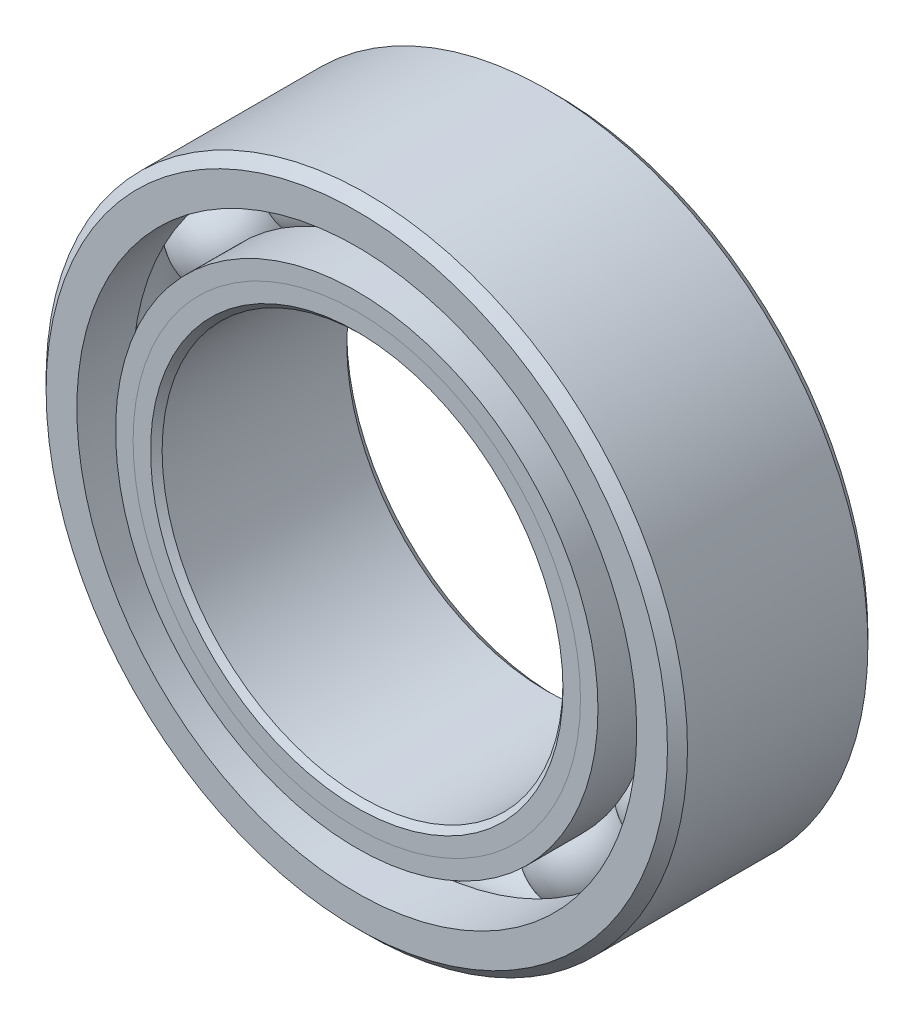
ISO-10303-21;
HEADER;
FILE_DESCRIPTION(('STEP AP214'),'2;1');
FILE_NAME('part.step','',(''),(''),'','','');
FILE_SCHEMA(('AUTOMOTIVE_DESIGN { 1 0 10303 214 1 1 1 1 }'));
ENDSEC;
DATA;
#1=APPLICATION_CONTEXT('core data for automotive mechanical design processes');
#2=APPLICATION_PROTOCOL_DEFINITION('international standard','automotive_design',2000,#1);
#3=PRODUCT_CONTEXT('',#1,'mechanical');
#4=PRODUCT('Part','Part','',(#3));
#5=PRODUCT_RELATED_PRODUCT_CATEGORY('part','',(#4));
#6=PRODUCT_DEFINITION_FORMATION('','',#4);
#7=PRODUCT_DEFINITION_CONTEXT('part definition',#1,'design');
#8=PRODUCT_DEFINITION('design','',#6,#7);
#9=PRODUCT_DEFINITION_SHAPE('','',#8);
#10=(LENGTH_UNIT() NAMED_UNIT(*) SI_UNIT(.MILLI.,.METRE.));
#11=(NAMED_UNIT(*) PLANE_ANGLE_UNIT() SI_UNIT($,.RADIAN.));
#12=(NAMED_UNIT(*) SI_UNIT($,.STERADIAN.) SOLID_ANGLE_UNIT());
#13=UNCERTAINTY_MEASURE_WITH_UNIT(LENGTH_MEASURE(1.E-05),#10,'distance_accuracy_value','');
#14=(GEOMETRIC_REPRESENTATION_CONTEXT(3) GLOBAL_UNCERTAINTY_ASSIGNED_CONTEXT((#13)) GLOBAL_UNIT_ASSIGNED_CONTEXT((#10,
#11,#12)) REPRESENTATION_CONTEXT('',''));
#15=CARTESIAN_POINT('',(0.,0.,0.));
#16=DIRECTION('',(0.,0.,1.));
#17=DIRECTION('',(1.,0.,0.));
#18=AXIS2_PLACEMENT_3D('',#15,#16,#17);
#19=CARTESIAN_POINT('',(-2.57968749999994,4.46814981765037,0.));
#20=DIRECTION('',(0.,0.,1.));
#21=DIRECTION('',(-0.499999999999989,0.866025403784445,0.));
#22=AXIS2_PLACEMENT_3D('',#19,#20,#21);
#23=SPHERICAL_SURFACE('',#22,0.961832467237323);
#24=CARTESIAN_POINT('',(-2.57968749999994,4.46814981765037,0.961832467237323));
#25=VERTEX_POINT('',#24);
#26=VERTEX_LOOP('',#25);
#27=FACE_BOUND('',#26,.T.);
#28=ADVANCED_FACE('F37',(#27),#23,.T.);
#29=CLOSED_SHELL('',(#28));
#30=MANIFOLD_SOLID_BREP('B2',#29);
#31=CARTESIAN_POINT('',(-4.46814981765031,2.57968750000005,0.));
#32=DIRECTION('',(0.,0.,1.));
#33=DIRECTION('',(-0.866025403784433,0.50000000000001,0.));
#34=AXIS2_PLACEMENT_3D('',#31,#32,#33);
#35=SPHERICAL_SURFACE('',#34,0.961832467237323);
#36=CARTESIAN_POINT('',(-4.46814981765031,2.57968750000005,0.961832467237323));
#37=VERTEX_POINT('',#36);
#38=VERTEX_LOOP('',#37);
#39=FACE_BOUND('',#38,.T.);
#40=ADVANCED_FACE('F68',(#39),#35,.T.);
#41=CLOSED_SHELL('',(#40));
#42=MANIFOLD_SOLID_BREP('B6',#41);
#43=CARTESIAN_POINT('',(-5.159375,0.,0.));
#44=DIRECTION('',(0.,0.,1.));
#45=DIRECTION('',(-1.,0.,0.));
#46=AXIS2_PLACEMENT_3D('',#43,#44,#45);
#47=SPHERICAL_SURFACE('',#46,0.961832467237323);
#48=CARTESIAN_POINT('',(-5.159375,0.,0.961832467237323));
#49=VERTEX_POINT('',#48);
#50=VERTEX_LOOP('',#49);
#51=FACE_BOUND('',#50,.T.);
#52=ADVANCED_FACE('F99',(#51),#47,.T.);
#53=CLOSED_SHELL('',(#52));
#54=MANIFOLD_SOLID_BREP('B33',#53);
#55=CARTESIAN_POINT('',(-4.46814981765036,-2.57968749999996,0.));
#56=DIRECTION('',(0.,0.,1.));
#57=DIRECTION('',(-0.866025403784443,-0.499999999999992,0.));
#58=AXIS2_PLACEMENT_3D('',#55,#56,#57);
#59=SPHERICAL_SURFACE('',#58,0.961832467237323);
#60=CARTESIAN_POINT('',(-4.46814981765036,-2.57968749999996,0.961832467237323));
#61=VERTEX_POINT('',#60);
#62=VERTEX_LOOP('',#61);
#63=FACE_BOUND('',#62,.T.);
#64=ADVANCED_FACE('F130',(#63),#59,.T.);
#65=CLOSED_SHELL('',(#64));
#66=MANIFOLD_SOLID_BREP('B64',#65);
#67=CARTESIAN_POINT('',(-2.57968750000004,-4.46814981765032,0.));
#68=DIRECTION('',(0.,0.,1.));
#69=DIRECTION('',(-0.500000000000007,-0.866025403784435,0.));
#70=AXIS2_PLACEMENT_3D('',#67,#68,#69);
#71=SPHERICAL_SURFACE('',#70,0.961832467237323);
#72=CARTESIAN_POINT('',(-2.57968750000004,-4.46814981765032,0.961832467237323));
#73=VERTEX_POINT('',#72);
#74=VERTEX_LOOP('',#73);
#75=FACE_BOUND('',#74,.T.);
#76=ADVANCED_FACE('F161',(#75),#71,.T.);
#77=CLOSED_SHELL('',(#76));
#78=MANIFOLD_SOLID_BREP('B95',#77);
#79=CARTESIAN_POINT('',(0.,-5.159375,0.));
#80=DIRECTION('',(0.,0.,1.));
#81=DIRECTION('',(0.,-1.,0.));
#82=AXIS2_PLACEMENT_3D('',#79,#80,#81);
#83=SPHERICAL_SURFACE('',#82,0.961832467237323);
#84=CARTESIAN_POINT('',(0.,-5.159375,0.961832467237323));
#85=VERTEX_POINT('',#84);
#86=VERTEX_LOOP('',#85);
#87=FACE_BOUND('',#86,.T.);
#88=ADVANCED_FACE('F192',(#87),#83,.T.);
#89=CLOSED_SHELL('',(#88));
#90=MANIFOLD_SOLID_BREP('B126',#89);
#91=CARTESIAN_POINT('',(2.57968749999997,-4.46814981765035,0.));
#92=DIRECTION('',(0.,0.,1.));
#93=DIRECTION('',(0.499999999999995,-0.866025403784442,0.));
#94=AXIS2_PLACEMENT_3D('',#91,#92,#93);
#95=SPHERICAL_SURFACE('',#94,0.961832467237323);
#96=CARTESIAN_POINT('',(2.57968749999997,-4.46814981765035,0.961832467237323));
#97=VERTEX_POINT('',#96);
#98=VERTEX_LOOP('',#97);
#99=FACE_BOUND('',#98,.T.);
#100=ADVANCED_FACE('F223',(#99),#95,.T.);
#101=CLOSED_SHELL('',(#100));
#102=MANIFOLD_SOLID_BREP('B157',#101);
#103=CARTESIAN_POINT('',(4.46814981765033,-2.57968750000002,0.));
#104=DIRECTION('',(0.,0.,1.));
#105=DIRECTION('',(0.866025403784436,-0.500000000000004,0.));
#106=AXIS2_PLACEMENT_3D('',#103,#104,#105);
#107=SPHERICAL_SURFACE('',#106,0.961832467237323);
#108=CARTESIAN_POINT('',(4.46814981765033,-2.57968750000002,0.961832467237323));
#109=VERTEX_POINT('',#108);
#110=VERTEX_LOOP('',#109);
#111=FACE_BOUND('',#110,.T.);
#112=ADVANCED_FACE('F254',(#111),#107,.T.);
#113=CLOSED_SHELL('',(#112));
#114=MANIFOLD_SOLID_BREP('B188',#113);
#115=CARTESIAN_POINT('',(5.159375,0.,0.));
#116=DIRECTION('',(0.,0.,1.));
#117=DIRECTION('',(1.,0.,0.));
#118=AXIS2_PLACEMENT_3D('',#115,#116,#117);
#119=SPHERICAL_SURFACE('',#118,0.961832467237323);
#120=CARTESIAN_POINT('',(5.159375,0.,0.961832467237323));
#121=VERTEX_POINT('',#120);
#122=VERTEX_LOOP('',#121);
#123=FACE_BOUND('',#122,.T.);
#124=ADVANCED_FACE('F285',(#123),#119,.T.);
#125=CLOSED_SHELL('',(#124));
#126=MANIFOLD_SOLID_BREP('B219',#125);
#127=CARTESIAN_POINT('',(4.46814981765034,2.57968749999999,0.));
#128=DIRECTION('',(0.,0.,1.));
#129=DIRECTION('',(0.86602540378444,0.499999999999998,0.));
#130=AXIS2_PLACEMENT_3D('',#127,#128,#129);
#131=SPHERICAL_SURFACE('',#130,0.961832467237323);
#132=CARTESIAN_POINT('',(4.46814981765034,2.57968749999999,0.961832467237323));
#133=VERTEX_POINT('',#132);
#134=VERTEX_LOOP('',#133);
#135=FACE_BOUND('',#134,.T.);
#136=ADVANCED_FACE('F316',(#135),#131,.T.);
#137=CLOSED_SHELL('',(#136));
#138=MANIFOLD_SOLID_BREP('B250',#137);
#139=CARTESIAN_POINT('',(2.57968750000001,4.46814981765033,0.));
#140=DIRECTION('',(0.,0.,1.));
#141=DIRECTION('',(0.500000000000001,0.866025403784438,0.));
#142=AXIS2_PLACEMENT_3D('',#139,#140,#141);
#143=SPHERICAL_SURFACE('',#142,0.961832467237323);
#144=CARTESIAN_POINT('',(2.57968750000001,4.46814981765033,0.961832467237323));
#145=VERTEX_POINT('',#144);
#146=VERTEX_LOOP('',#145);
#147=FACE_BOUND('',#146,.T.);
#148=ADVANCED_FACE('F347',(#147),#143,.T.);
#149=CLOSED_SHELL('',(#148));
#150=MANIFOLD_SOLID_BREP('B281',#149);
#151=CARTESIAN_POINT('',(0.,5.159375,0.));
#152=DIRECTION('',(0.,0.,1.));
#153=DIRECTION('',(0.,1.,0.));
#154=AXIS2_PLACEMENT_3D('',#151,#152,#153);
#155=SPHERICAL_SURFACE('',#154,0.961832467237323);
#156=CARTESIAN_POINT('',(0.,5.159375,0.961832467237323));
#157=VERTEX_POINT('',#156);
#158=VERTEX_LOOP('',#157);
#159=FACE_BOUND('',#158,.T.);
#160=ADVANCED_FACE('F380',(#159),#155,.T.);
#161=CLOSED_SHELL('',(#160));
#162=MANIFOLD_SOLID_BREP('B312',#161);
#163=CARTESIAN_POINT('',(0.,4.42936502879506,1.984375));
#164=DIRECTION('',(0.,0.,-1.));
#165=DIRECTION('',(-1.,0.,0.));
#166=AXIS2_PLACEMENT_3D('',#163,#164,#165);
#167=PLANE('',#166);
#168=CARTESIAN_POINT('',(0.,0.,1.984375));
#169=DIRECTION('',(0.,0.,1.));
#170=DIRECTION('',(1.,0.,0.));
#171=AXIS2_PLACEMENT_3D('',#168,#169,#170);
#172=CIRCLE('',#171,4.08314626638134);
#173=CARTESIAN_POINT('',(4.08314626638134,0.,1.984375));
#174=VERTEX_POINT('',#173);
#175=EDGE_CURVE('E434',#174,#174,#172,.T.);
#176=ORIENTED_EDGE('',*,*,#175,.F.);
#177=EDGE_LOOP('',(#176));
#178=FACE_BOUND('',#177,.T.);
#179=CARTESIAN_POINT('',(0.,0.,1.984375));
#180=DIRECTION('',(0.,0.,1.));
#181=DIRECTION('',(1.,0.,0.));
#182=AXIS2_PLACEMENT_3D('',#179,#180,#181);
#183=CIRCLE('',#182,4.42936502879506);
#184=CARTESIAN_POINT('',(4.42936502879506,0.,1.984375));
#185=VERTEX_POINT('',#184);
#186=EDGE_CURVE('E379',#185,#185,#183,.T.);
#187=ORIENTED_EDGE('',*,*,#186,.T.);
#188=EDGE_LOOP('',(#187));
#189=FACE_BOUND('',#188,.T.);
#190=ADVANCED_FACE('F400',(#178,#189),#167,.F.);
#191=CARTESIAN_POINT('',(0.,0.,1.63815623758628));
#192=DIRECTION('',(0.,0.,1.));
#193=DIRECTION('',(1.,0.,0.));
#194=AXIS2_PLACEMENT_3D('',#191,#192,#193);
#195=CONICAL_SURFACE('',#194,4.08314626638134,0.78539816339745);
#196=ORIENTED_EDGE('',*,*,#186,.F.);
#197=EDGE_LOOP('',(#196));
#198=FACE_BOUND('',#197,.T.);
#199=CARTESIAN_POINT('',(0.,0.,1.63815623758628));
#200=DIRECTION('',(0.,0.,1.));
#201=DIRECTION('',(1.,0.,0.));
#202=AXIS2_PLACEMENT_3D('',#199,#200,#201);
#203=CIRCLE('',#202,4.08314626638134);
#204=CARTESIAN_POINT('',(4.08314626638134,0.,1.63815623758628));
#205=VERTEX_POINT('',#204);
#206=EDGE_CURVE('E406',#205,#205,#203,.T.);
#207=ORIENTED_EDGE('',*,*,#206,.T.);
#208=EDGE_LOOP('',(#207));
#209=FACE_BOUND('',#208,.T.);
#210=ADVANCED_FACE('F441',(#198,#209),#195,.T.);
#211=CARTESIAN_POINT('',(0.,0.,1.984375));
#212=DIRECTION('',(0.,0.,1.));
#213=DIRECTION('',(1.,0.,0.));
#214=AXIS2_PLACEMENT_3D('',#211,#212,#213);
#215=CYLINDRICAL_SURFACE('',#214,4.08314626638134);
#216=ORIENTED_EDGE('',*,*,#206,.F.);
#217=EDGE_LOOP('',(#216));
#218=FACE_BOUND('',#217,.T.);
#219=CARTESIAN_POINT('',(0.,0.,0.));
#220=DIRECTION('',(0.,0.,1.));
#221=DIRECTION('',(1.,0.,0.));
#222=AXIS2_PLACEMENT_3D('',#219,#220,#221);
#223=CIRCLE('',#222,4.08314626638134);
#224=CARTESIAN_POINT('',(4.08314626638134,0.,0.));
#225=VERTEX_POINT('',#224);
#226=EDGE_CURVE('E410',#225,#225,#223,.T.);
#227=ORIENTED_EDGE('',*,*,#226,.T.);
#228=EDGE_LOOP('',(#227));
#229=FACE_BOUND('',#228,.T.);
#230=ADVANCED_FACE('F445',(#218,#229),#215,.T.);
#231=CARTESIAN_POINT('',(0.,4.08314626638134,0.));
#232=DIRECTION('',(0.,0.,-1.));
#233=DIRECTION('',(-1.,0.,0.));
#234=AXIS2_PLACEMENT_3D('',#231,#232,#233);
#235=PLANE('',#234);
#236=ORIENTED_EDGE('',*,*,#226,.F.);
#237=EDGE_LOOP('',(#236));
#238=FACE_BOUND('',#237,.T.);
#239=CARTESIAN_POINT('',(0.,0.,0.));
#240=DIRECTION('',(0.,0.,1.));
#241=DIRECTION('',(1.,0.,0.));
#242=AXIS2_PLACEMENT_3D('',#239,#240,#241);
#243=CIRCLE('',#242,4.19754253276268);
#244=CARTESIAN_POINT('',(4.19754253276268,0.,0.));
#245=VERTEX_POINT('',#244);
#246=EDGE_CURVE('E414',#245,#245,#243,.T.);
#247=ORIENTED_EDGE('',*,*,#246,.T.);
#248=EDGE_LOOP('',(#247));
#249=FACE_BOUND('',#248,.T.);
#250=ADVANCED_FACE('F450',(#238,#249),#235,.F.);
#251=CARTESIAN_POINT('',(0.,0.,0.));
#252=DIRECTION('',(0.,0.,1.));
#253=DIRECTION('',(1.,0.,0.));
#254=AXIS2_PLACEMENT_3D('',#251,#252,#253);
#255=TOROIDAL_SURFACE('',#254,5.159375,0.961832467237323);
#256=ORIENTED_EDGE('',*,*,#246,.F.);
#257=EDGE_LOOP('',(#256));
#258=FACE_BOUND('',#257,.T.);
#259=CARTESIAN_POINT('',(0.,0.,-0.881944444444444));
#260=DIRECTION('',(0.,0.,1.));
#261=DIRECTION('',(1.,0.,0.));
#262=AXIS2_PLACEMENT_3D('',#259,#260,#261);
#263=CIRCLE('',#262,4.77558379120879);
#264=CARTESIAN_POINT('',(4.77558379120879,0.,-0.881944444444444));
#265=VERTEX_POINT('',#264);
#266=EDGE_CURVE('E419',#265,#265,#263,.T.);
#267=ORIENTED_EDGE('',*,*,#266,.T.);
#268=EDGE_LOOP('',(#267));
#269=FACE_BOUND('',#268,.T.);
#270=ADVANCED_FACE('F456',(#258,#269),#255,.F.);
#271=CARTESIAN_POINT('',(0.,0.,1.984375));
#272=DIRECTION('',(0.,0.,1.));
#273=DIRECTION('',(1.,0.,0.));
#274=AXIS2_PLACEMENT_3D('',#271,#272,#273);
#275=CYLINDRICAL_SURFACE('',#274,4.77558379120879);
#276=ORIENTED_EDGE('',*,*,#266,.F.);
#277=EDGE_LOOP('',(#276));
#278=FACE_BOUND('',#277,.T.);
#279=CARTESIAN_POINT('',(0.,0.,-1.984375));
#280=DIRECTION('',(0.,0.,1.));
#281=DIRECTION('',(1.,0.,0.));
#282=AXIS2_PLACEMENT_3D('',#279,#280,#281);
#283=CIRCLE('',#282,4.77558379120879);
#284=CARTESIAN_POINT('',(4.77558379120879,0.,-1.984375));
#285=VERTEX_POINT('',#284);
#286=EDGE_CURVE('E422',#285,#285,#283,.T.);
#287=ORIENTED_EDGE('',*,*,#286,.T.);
#288=EDGE_LOOP('',(#287));
#289=FACE_BOUND('',#288,.T.);
#290=ADVANCED_FACE('F460',(#278,#289),#275,.T.);
#291=CARTESIAN_POINT('',(0.,4.1671875,-1.984375));
#292=DIRECTION('',(0.,0.,1.));
#293=DIRECTION('',(1.,0.,0.));
#294=AXIS2_PLACEMENT_3D('',#291,#292,#293);
#295=PLANE('',#294);
#296=ORIENTED_EDGE('',*,*,#286,.F.);
#297=EDGE_LOOP('',(#296));
#298=FACE_BOUND('',#297,.T.);
#299=CARTESIAN_POINT('',(0.,0.,-1.984375));
#300=DIRECTION('',(0.,0.,1.));
#301=DIRECTION('',(1.,0.,0.));
#302=AXIS2_PLACEMENT_3D('',#299,#300,#301);
#303=CIRCLE('',#302,4.1671875);
#304=CARTESIAN_POINT('',(4.1671875,0.,-1.984375));
#305=VERTEX_POINT('',#304);
#306=EDGE_CURVE('E425',#305,#305,#303,.T.);
#307=ORIENTED_EDGE('',*,*,#306,.T.);
#308=EDGE_LOOP('',(#307));
#309=FACE_BOUND('',#308,.T.);
#310=ADVANCED_FACE('F464',(#298,#309),#295,.F.);
#311=CARTESIAN_POINT('',(0.,0.,-1.7859375));
#312=DIRECTION('',(0.,0.,-1.));
#313=DIRECTION('',(-1.,0.,0.));
#314=AXIS2_PLACEMENT_3D('',#311,#312,#313);
#315=CONICAL_SURFACE('',#314,3.96875,0.785398163397446);
#316=ORIENTED_EDGE('',*,*,#306,.F.);
#317=EDGE_LOOP('',(#316));
#318=FACE_BOUND('',#317,.T.);
#319=CARTESIAN_POINT('',(0.,0.,-1.7859375));
#320=DIRECTION('',(0.,0.,1.));
#321=DIRECTION('',(1.,0.,0.));
#322=AXIS2_PLACEMENT_3D('',#319,#320,#321);
#323=CIRCLE('',#322,3.96875);
#324=CARTESIAN_POINT('',(3.96875,0.,-1.7859375));
#325=VERTEX_POINT('',#324);
#326=EDGE_CURVE('E428',#325,#325,#323,.T.);
#327=ORIENTED_EDGE('',*,*,#326,.T.);
#328=EDGE_LOOP('',(#327));
#329=FACE_BOUND('',#328,.T.);
#330=ADVANCED_FACE('F468',(#318,#329),#315,.F.);
#331=CARTESIAN_POINT('',(0.,0.,1.984375));
#332=DIRECTION('',(0.,0.,1.));
#333=DIRECTION('',(1.,0.,0.));
#334=AXIS2_PLACEMENT_3D('',#331,#332,#333);
#335=CYLINDRICAL_SURFACE('',#334,3.96875);
#336=ORIENTED_EDGE('',*,*,#326,.F.);
#337=EDGE_LOOP('',(#336));
#338=FACE_BOUND('',#337,.T.);
#339=CARTESIAN_POINT('',(0.,0.,1.86997873361866));
#340=DIRECTION('',(0.,0.,1.));
#341=DIRECTION('',(1.,0.,0.));
#342=AXIS2_PLACEMENT_3D('',#339,#340,#341);
#343=CIRCLE('',#342,3.96875);
#344=CARTESIAN_POINT('',(3.96875,0.,1.86997873361866));
#345=VERTEX_POINT('',#344);
#346=EDGE_CURVE('E431',#345,#345,#343,.T.);
#347=ORIENTED_EDGE('',*,*,#346,.T.);
#348=EDGE_LOOP('',(#347));
#349=FACE_BOUND('',#348,.T.);
#350=ADVANCED_FACE('F472',(#338,#349),#335,.F.);
#351=CARTESIAN_POINT('',(0.,0.,1.984375));
#352=DIRECTION('',(0.,0.,1.));
#353=DIRECTION('',(1.,0.,0.));
#354=AXIS2_PLACEMENT_3D('',#351,#352,#353);
#355=CONICAL_SURFACE('',#354,4.08314626638134,0.78539816339745);
#356=ORIENTED_EDGE('',*,*,#346,.F.);
#357=EDGE_LOOP('',(#356));
#358=FACE_BOUND('',#357,.T.);
#359=ORIENTED_EDGE('',*,*,#175,.T.);
#360=EDGE_LOOP('',(#359));
#361=FACE_BOUND('',#360,.T.);
#362=ADVANCED_FACE('F438',(#358,#361),#355,.F.);
#363=CLOSED_SHELL('',(#190,#210,#230,#250,#270,#290,#310,#330,#350,#362));
#364=MANIFOLD_SOLID_BREP('B343',#363);
#365=CARTESIAN_POINT('',(0.,4.77558379120879,1.984375));
#366=DIRECTION('',(0.,0.,-1.));
#367=DIRECTION('',(-1.,0.,0.));
#368=AXIS2_PLACEMENT_3D('',#365,#366,#367);
#369=PLANE('',#368);
#370=CARTESIAN_POINT('',(0.,0.,1.984375));
#371=DIRECTION('',(0.,0.,1.));
#372=DIRECTION('',(1.,0.,0.));
#373=AXIS2_PLACEMENT_3D('',#370,#371,#372);
#374=CIRCLE('',#373,4.42936502879506);
#375=CARTESIAN_POINT('',(4.42936502879506,0.,1.984375));
#376=VERTEX_POINT('',#375);
#377=EDGE_CURVE('E399',#376,#376,#374,.T.);
#378=ORIENTED_EDGE('',*,*,#377,.F.);
#379=EDGE_LOOP('',(#378));
#380=FACE_BOUND('',#379,.T.);
#381=CARTESIAN_POINT('',(0.,0.,1.984375));
#382=DIRECTION('',(0.,0.,1.));
#383=DIRECTION('',(1.,0.,0.));
#384=AXIS2_PLACEMENT_3D('',#381,#382,#383);
#385=CIRCLE('',#384,4.77558379120879);
#386=CARTESIAN_POINT('',(4.77558379120879,0.,1.984375));
#387=VERTEX_POINT('',#386);
#388=EDGE_CURVE('E580',#387,#387,#385,.T.);
#389=ORIENTED_EDGE('',*,*,#388,.T.);
#390=EDGE_LOOP('',(#389));
#391=FACE_BOUND('',#390,.T.);
#392=ADVANCED_FACE('F558',(#380,#391),#369,.F.);
#393=CARTESIAN_POINT('',(0.,0.,1.984375));
#394=DIRECTION('',(0.,0.,1.));
#395=DIRECTION('',(1.,0.,0.));
#396=AXIS2_PLACEMENT_3D('',#393,#394,#395);
#397=CONICAL_SURFACE('',#396,4.42936502879506,0.78539816339745);
#398=CARTESIAN_POINT('',(0.,0.,1.63815623758628));
#399=DIRECTION('',(0.,0.,1.));
#400=DIRECTION('',(1.,0.,0.));
#401=AXIS2_PLACEMENT_3D('',#398,#399,#400);
#402=CIRCLE('',#401,4.08314626638134);
#403=CARTESIAN_POINT('',(4.08314626638134,0.,1.63815623758628));
#404=VERTEX_POINT('',#403);
#405=EDGE_CURVE('E564',#404,#404,#402,.T.);
#406=ORIENTED_EDGE('',*,*,#405,.F.);
#407=EDGE_LOOP('',(#406));
#408=FACE_BOUND('',#407,.T.);
#409=ORIENTED_EDGE('',*,*,#377,.T.);
#410=EDGE_LOOP('',(#409));
#411=FACE_BOUND('',#410,.T.);
#412=ADVANCED_FACE('F605',(#408,#411),#397,.F.);
#413=CARTESIAN_POINT('',(0.,0.,1.984375));
#414=DIRECTION('',(0.,0.,1.));
#415=DIRECTION('',(1.,0.,0.));
#416=AXIS2_PLACEMENT_3D('',#413,#414,#415);
#417=CYLINDRICAL_SURFACE('',#416,4.08314626638134);
#418=CARTESIAN_POINT('',(0.,0.,0.));
#419=DIRECTION('',(0.,0.,1.));
#420=DIRECTION('',(1.,0.,0.));
#421=AXIS2_PLACEMENT_3D('',#418,#419,#420);
#422=CIRCLE('',#421,4.08314626638134);
#423=CARTESIAN_POINT('',(4.08314626638134,0.,0.));
#424=VERTEX_POINT('',#423);
#425=EDGE_CURVE('E568',#424,#424,#422,.T.);
#426=ORIENTED_EDGE('',*,*,#425,.F.);
#427=EDGE_LOOP('',(#426));
#428=FACE_BOUND('',#427,.T.);
#429=ORIENTED_EDGE('',*,*,#405,.T.);
#430=EDGE_LOOP('',(#429));
#431=FACE_BOUND('',#430,.T.);
#432=ADVANCED_FACE('F600',(#428,#431),#417,.F.);
#433=CARTESIAN_POINT('',(0.,4.08314626638134,0.));
#434=DIRECTION('',(0.,0.,1.));
#435=DIRECTION('',(1.,0.,0.));
#436=AXIS2_PLACEMENT_3D('',#433,#434,#435);
#437=PLANE('',#436);
#438=CARTESIAN_POINT('',(0.,0.,0.));
#439=DIRECTION('',(0.,0.,1.));
#440=DIRECTION('',(1.,0.,0.));
#441=AXIS2_PLACEMENT_3D('',#438,#439,#440);
#442=CIRCLE('',#441,4.19754253276268);
#443=CARTESIAN_POINT('',(4.19754253276268,0.,0.));
#444=VERTEX_POINT('',#443);
#445=EDGE_CURVE('E572',#444,#444,#442,.T.);
#446=ORIENTED_EDGE('',*,*,#445,.F.);
#447=EDGE_LOOP('',(#446));
#448=FACE_BOUND('',#447,.T.);
#449=ORIENTED_EDGE('',*,*,#425,.T.);
#450=EDGE_LOOP('',(#449));
#451=FACE_BOUND('',#450,.T.);
#452=ADVANCED_FACE('F594',(#448,#451),#437,.F.);
#453=CARTESIAN_POINT('',(0.,0.,0.));
#454=DIRECTION('',(0.,0.,1.));
#455=DIRECTION('',(1.,0.,0.));
#456=AXIS2_PLACEMENT_3D('',#453,#454,#455);
#457=TOROIDAL_SURFACE('',#456,5.159375,0.961832467237323);
#458=CARTESIAN_POINT('',(0.,0.,0.881944444444444));
#459=DIRECTION('',(0.,0.,1.));
#460=DIRECTION('',(1.,0.,0.));
#461=AXIS2_PLACEMENT_3D('',#458,#459,#460);
#462=CIRCLE('',#461,4.77558379120879);
#463=CARTESIAN_POINT('',(4.77558379120879,0.,0.881944444444444));
#464=VERTEX_POINT('',#463);
#465=EDGE_CURVE('E577',#464,#464,#462,.T.);
#466=ORIENTED_EDGE('',*,*,#465,.F.);
#467=EDGE_LOOP('',(#466));
#468=FACE_BOUND('',#467,.T.);
#469=ORIENTED_EDGE('',*,*,#445,.T.);
#470=EDGE_LOOP('',(#469));
#471=FACE_BOUND('',#470,.T.);
#472=ADVANCED_FACE('F588',(#468,#471),#457,.F.);
#473=CARTESIAN_POINT('',(0.,0.,1.984375));
#474=DIRECTION('',(0.,0.,1.));
#475=DIRECTION('',(1.,0.,0.));
#476=AXIS2_PLACEMENT_3D('',#473,#474,#475);
#477=CYLINDRICAL_SURFACE('',#476,4.77558379120879);
#478=ORIENTED_EDGE('',*,*,#388,.F.);
#479=EDGE_LOOP('',(#478));
#480=FACE_BOUND('',#479,.T.);
#481=ORIENTED_EDGE('',*,*,#465,.T.);
#482=EDGE_LOOP('',(#481));
#483=FACE_BOUND('',#482,.T.);
#484=ADVANCED_FACE('F585',(#480,#483),#477,.T.);
#485=CLOSED_SHELL('',(#392,#412,#432,#452,#472,#484));
#486=MANIFOLD_SOLID_BREP('B374',#485);
#487=CARTESIAN_POINT('',(0.,0.,1.7859375));
#488=DIRECTION('',(0.,0.,-1.));
#489=DIRECTION('',(-1.,0.,0.));
#490=AXIS2_PLACEMENT_3D('',#487,#488,#489);
#491=CONICAL_SURFACE('',#490,6.35,0.785398163397447);
#492=CARTESIAN_POINT('',(0.,0.,1.984375));
#493=DIRECTION('',(0.,0.,1.));
#494=DIRECTION('',(1.,0.,0.));
#495=AXIS2_PLACEMENT_3D('',#492,#493,#494);
#496=CIRCLE('',#495,6.1515625);
#497=CARTESIAN_POINT('',(6.1515625,0.,1.984375));
#498=VERTEX_POINT('',#497);
#499=EDGE_CURVE('E677',#498,#498,#496,.T.);
#500=ORIENTED_EDGE('',*,*,#499,.F.);
#501=EDGE_LOOP('',(#500));
#502=FACE_BOUND('',#501,.T.);
#503=CARTESIAN_POINT('',(0.,0.,1.7859375));
#504=DIRECTION('',(0.,0.,1.));
#505=DIRECTION('',(1.,0.,0.));
#506=AXIS2_PLACEMENT_3D('',#503,#504,#505);
#507=CIRCLE('',#506,6.35);
#508=CARTESIAN_POINT('',(6.35,0.,1.7859375));
#509=VERTEX_POINT('',#508);
#510=EDGE_CURVE('E557',#509,#509,#507,.T.);
#511=ORIENTED_EDGE('',*,*,#510,.T.);
#512=EDGE_LOOP('',(#511));
#513=FACE_BOUND('',#512,.T.);
#514=ADVANCED_FACE('F649',(#502,#513),#491,.T.);
#515=CARTESIAN_POINT('',(0.,0.,1.984375));
#516=DIRECTION('',(0.,0.,1.));
#517=DIRECTION('',(1.,0.,0.));
#518=AXIS2_PLACEMENT_3D('',#515,#516,#517);
#519=CYLINDRICAL_SURFACE('',#518,6.35);
#520=ORIENTED_EDGE('',*,*,#510,.F.);
#521=EDGE_LOOP('',(#520));
#522=FACE_BOUND('',#521,.T.);
#523=CARTESIAN_POINT('',(0.,0.,-1.7859375));
#524=DIRECTION('',(0.,0.,1.));
#525=DIRECTION('',(1.,0.,0.));
#526=AXIS2_PLACEMENT_3D('',#523,#524,#525);
#527=CIRCLE('',#526,6.35);
#528=CARTESIAN_POINT('',(6.35,0.,-1.7859375));
#529=VERTEX_POINT('',#528);
#530=EDGE_CURVE('E655',#529,#529,#527,.T.);
#531=ORIENTED_EDGE('',*,*,#530,.T.);
#532=EDGE_LOOP('',(#531));
#533=FACE_BOUND('',#532,.T.);
#534=ADVANCED_FACE('F684',(#522,#533),#519,.T.);
#535=CARTESIAN_POINT('',(0.,0.,-1.984375));
#536=DIRECTION('',(0.,0.,1.));
#537=DIRECTION('',(1.,0.,0.));
#538=AXIS2_PLACEMENT_3D('',#535,#536,#537);
#539=CONICAL_SURFACE('',#538,6.1515625,0.785398163397446);
#540=ORIENTED_EDGE('',*,*,#530,.F.);
#541=EDGE_LOOP('',(#540));
#542=FACE_BOUND('',#541,.T.);
#543=CARTESIAN_POINT('',(0.,0.,-1.984375));
#544=DIRECTION('',(0.,0.,1.));
#545=DIRECTION('',(1.,0.,0.));
#546=AXIS2_PLACEMENT_3D('',#543,#544,#545);
#547=CIRCLE('',#546,6.1515625);
#548=CARTESIAN_POINT('',(6.1515625,0.,-1.984375));
#549=VERTEX_POINT('',#548);
#550=EDGE_CURVE('E659',#549,#549,#547,.T.);
#551=ORIENTED_EDGE('',*,*,#550,.T.);
#552=EDGE_LOOP('',(#551));
#553=FACE_BOUND('',#552,.T.);
#554=ADVANCED_FACE('F688',(#542,#553),#539,.T.);
#555=CARTESIAN_POINT('',(0.,6.1515625,-1.984375));
#556=DIRECTION('',(0.,0.,1.));
#557=DIRECTION('',(1.,0.,0.));
#558=AXIS2_PLACEMENT_3D('',#555,#556,#557);
#559=PLANE('',#558);
#560=ORIENTED_EDGE('',*,*,#550,.F.);
#561=EDGE_LOOP('',(#560));
#562=FACE_BOUND('',#561,.T.);
#563=CARTESIAN_POINT('',(0.,0.,-1.984375));
#564=DIRECTION('',(0.,0.,1.));
#565=DIRECTION('',(1.,0.,0.));
#566=AXIS2_PLACEMENT_3D('',#563,#564,#565);
#567=CIRCLE('',#566,5.54316620879121);
#568=CARTESIAN_POINT('',(5.54316620879121,0.,-1.984375));
#569=VERTEX_POINT('',#568);
#570=EDGE_CURVE('E663',#569,#569,#567,.T.);
#571=ORIENTED_EDGE('',*,*,#570,.T.);
#572=EDGE_LOOP('',(#571));
#573=FACE_BOUND('',#572,.T.);
#574=ADVANCED_FACE('F693',(#562,#573),#559,.F.);
#575=CARTESIAN_POINT('',(0.,0.,1.984375));
#576=DIRECTION('',(0.,0.,1.));
#577=DIRECTION('',(1.,0.,0.));
#578=AXIS2_PLACEMENT_3D('',#575,#576,#577);
#579=CYLINDRICAL_SURFACE('',#578,5.54316620879121);
#580=ORIENTED_EDGE('',*,*,#570,.F.);
#581=EDGE_LOOP('',(#580));
#582=FACE_BOUND('',#581,.T.);
#583=CARTESIAN_POINT('',(0.,0.,-0.881944444444445));
#584=DIRECTION('',(0.,0.,1.));
#585=DIRECTION('',(1.,0.,0.));
#586=AXIS2_PLACEMENT_3D('',#583,#584,#585);
#587=CIRCLE('',#586,5.54316620879121);
#588=CARTESIAN_POINT('',(5.54316620879121,0.,-0.881944444444445));
#589=VERTEX_POINT('',#588);
#590=EDGE_CURVE('E668',#589,#589,#587,.T.);
#591=ORIENTED_EDGE('',*,*,#590,.T.);
#592=EDGE_LOOP('',(#591));
#593=FACE_BOUND('',#592,.T.);
#594=ADVANCED_FACE('F699',(#582,#593),#579,.F.);
#595=CARTESIAN_POINT('',(0.,0.,0.));
#596=DIRECTION('',(0.,0.,1.));
#597=DIRECTION('',(1.,0.,0.));
#598=AXIS2_PLACEMENT_3D('',#595,#596,#597);
#599=TOROIDAL_SURFACE('',#598,5.159375,0.961832467237323);
#600=ORIENTED_EDGE('',*,*,#590,.F.);
#601=EDGE_LOOP('',(#600));
#602=FACE_BOUND('',#601,.T.);
#603=CARTESIAN_POINT('',(0.,0.,0.881944444444444));
#604=DIRECTION('',(0.,0.,1.));
#605=DIRECTION('',(1.,0.,0.));
#606=AXIS2_PLACEMENT_3D('',#603,#604,#605);
#607=CIRCLE('',#606,5.54316620879121);
#608=CARTESIAN_POINT('',(5.54316620879121,0.,0.881944444444444));
#609=VERTEX_POINT('',#608);
#610=EDGE_CURVE('E671',#609,#609,#607,.T.);
#611=ORIENTED_EDGE('',*,*,#610,.T.);
#612=EDGE_LOOP('',(#611));
#613=FACE_BOUND('',#612,.T.);
#614=ADVANCED_FACE('F703',(#602,#613),#599,.F.);
#615=CARTESIAN_POINT('',(0.,0.,1.984375));
#616=DIRECTION('',(0.,0.,1.));
#617=DIRECTION('',(1.,0.,0.));
#618=AXIS2_PLACEMENT_3D('',#615,#616,#617);
#619=CYLINDRICAL_SURFACE('',#618,5.54316620879121);
#620=ORIENTED_EDGE('',*,*,#610,.F.);
#621=EDGE_LOOP('',(#620));
#622=FACE_BOUND('',#621,.T.);
#623=CARTESIAN_POINT('',(0.,0.,1.984375));
#624=DIRECTION('',(0.,0.,1.));
#625=DIRECTION('',(1.,0.,0.));
#626=AXIS2_PLACEMENT_3D('',#623,#624,#625);
#627=CIRCLE('',#626,5.54316620879121);
#628=CARTESIAN_POINT('',(5.54316620879121,0.,1.984375));
#629=VERTEX_POINT('',#628);
#630=EDGE_CURVE('E674',#629,#629,#627,.T.);
#631=ORIENTED_EDGE('',*,*,#630,.T.);
#632=EDGE_LOOP('',(#631));
#633=FACE_BOUND('',#632,.T.);
#634=ADVANCED_FACE('F707',(#622,#633),#619,.F.);
#635=CARTESIAN_POINT('',(0.,6.1515625,1.984375));
#636=DIRECTION('',(0.,0.,-1.));
#637=DIRECTION('',(-1.,0.,0.));
#638=AXIS2_PLACEMENT_3D('',#635,#636,#637);
#639=PLANE('',#638);
#640=ORIENTED_EDGE('',*,*,#630,.F.);
#641=EDGE_LOOP('',(#640));
#642=FACE_BOUND('',#641,.T.);
#643=ORIENTED_EDGE('',*,*,#499,.T.);
#644=EDGE_LOOP('',(#643));
#645=FACE_BOUND('',#644,.T.);
#646=ADVANCED_FACE('F681',(#642,#645),#639,.F.);
#647=CLOSED_SHELL('',(#514,#534,#554,#574,#594,#614,#634,#646));
#648=MANIFOLD_SOLID_BREP('B394',#647);
#649=ADVANCED_BREP_SHAPE_REPRESENTATION('',(#18,#30,#42,#54,#66,#78,#90,#102,#114,#126,#138,
#150,#162,#364,#486,#648),#14);
#650=SHAPE_DEFINITION_REPRESENTATION(#9,#649);
ENDSEC;
END-ISO-10303-21;
